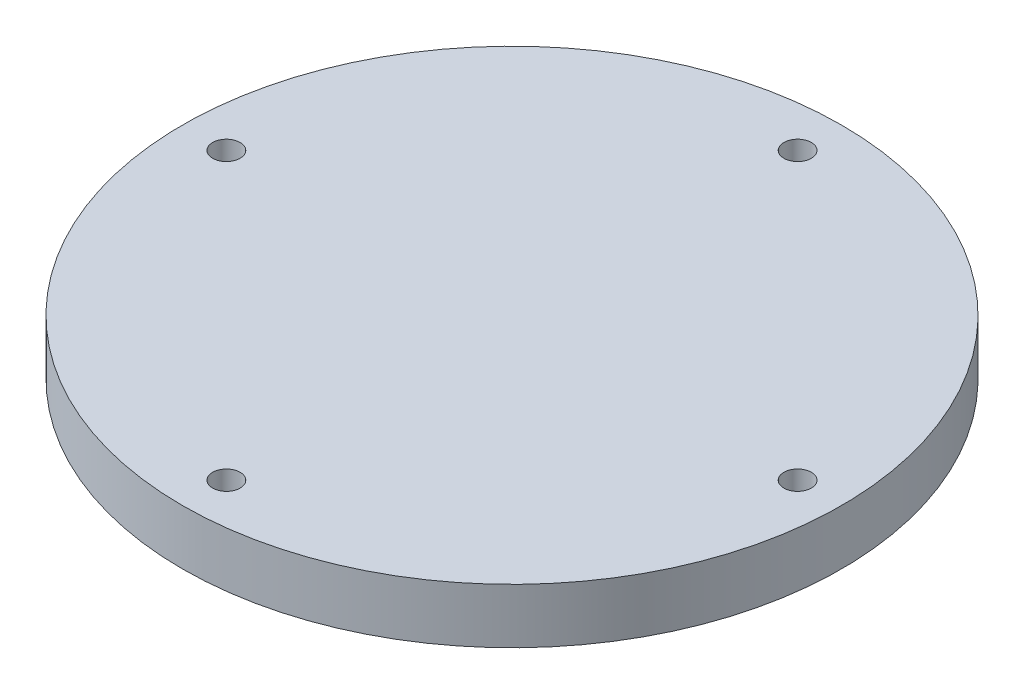
ISO-10303-21;
HEADER;
FILE_DESCRIPTION(('STEP AP214'),'2;1');
FILE_NAME('part.step','',(''),(''),'','','');
FILE_SCHEMA(('AUTOMOTIVE_DESIGN { 1 0 10303 214 1 1 1 1 }'));
ENDSEC;
DATA;
#1=APPLICATION_CONTEXT('core data for automotive mechanical design processes');
#2=APPLICATION_PROTOCOL_DEFINITION('international standard','automotive_design',2000,#1);
#3=PRODUCT_CONTEXT('',#1,'mechanical');
#4=PRODUCT('Part','Part','',(#3));
#5=PRODUCT_RELATED_PRODUCT_CATEGORY('part','',(#4));
#6=PRODUCT_DEFINITION_FORMATION('','',#4);
#7=PRODUCT_DEFINITION_CONTEXT('part definition',#1,'design');
#8=PRODUCT_DEFINITION('design','',#6,#7);
#9=PRODUCT_DEFINITION_SHAPE('','',#8);
#10=(LENGTH_UNIT() NAMED_UNIT(*) SI_UNIT(.MILLI.,.METRE.));
#11=(NAMED_UNIT(*) PLANE_ANGLE_UNIT() SI_UNIT($,.RADIAN.));
#12=(NAMED_UNIT(*) SI_UNIT($,.STERADIAN.) SOLID_ANGLE_UNIT());
#13=UNCERTAINTY_MEASURE_WITH_UNIT(LENGTH_MEASURE(1.E-05),#10,'distance_accuracy_value','');
#14=(GEOMETRIC_REPRESENTATION_CONTEXT(3) GLOBAL_UNCERTAINTY_ASSIGNED_CONTEXT((#13)) GLOBAL_UNIT_ASSIGNED_CONTEXT((#10,
#11,#12)) REPRESENTATION_CONTEXT('',''));
#15=CARTESIAN_POINT('',(0.,0.,0.));
#16=DIRECTION('',(0.,0.,1.));
#17=DIRECTION('',(1.,0.,0.));
#18=AXIS2_PLACEMENT_3D('',#15,#16,#17);
#19=CARTESIAN_POINT('',(0.,6.35,0.));
#20=DIRECTION('',(0.,1.,0.));
#21=DIRECTION('',(0.,0.,1.));
#22=AXIS2_PLACEMENT_3D('',#19,#20,#21);
#23=PLANE('',#22);
#24=CARTESIAN_POINT('',(0.,6.35,33.02));
#25=DIRECTION('',(0.,1.,0.));
#26=DIRECTION('',(0.,0.,1.));
#27=AXIS2_PLACEMENT_3D('',#24,#25,#26);
#28=CIRCLE('',#27,1.5875);
#29=CARTESIAN_POINT('',(0.,6.35,34.6075));
#30=VERTEX_POINT('',#29);
#31=EDGE_CURVE('E53',#30,#30,#28,.T.);
#32=ORIENTED_EDGE('',*,*,#31,.F.);
#33=EDGE_LOOP('',(#32));
#34=FACE_BOUND('',#33,.T.);
#35=CARTESIAN_POINT('',(0.,6.35,-33.02));
#36=DIRECTION('',(0.,1.,0.));
#37=DIRECTION('',(0.,0.,1.));
#38=AXIS2_PLACEMENT_3D('',#35,#36,#37);
#39=CIRCLE('',#38,1.5875);
#40=CARTESIAN_POINT('',(0.,6.35,-31.4325));
#41=VERTEX_POINT('',#40);
#42=EDGE_CURVE('E42',#41,#41,#39,.T.);
#43=ORIENTED_EDGE('',*,*,#42,.F.);
#44=EDGE_LOOP('',(#43));
#45=FACE_BOUND('',#44,.T.);
#46=CARTESIAN_POINT('',(0.,6.35,0.));
#47=DIRECTION('',(0.,1.,0.));
#48=DIRECTION('',(0.,0.,1.));
#49=AXIS2_PLACEMENT_3D('',#46,#47,#48);
#50=CIRCLE('',#49,38.1);
#51=CARTESIAN_POINT('',(0.,6.35,38.1));
#52=VERTEX_POINT('',#51);
#53=EDGE_CURVE('E10',#52,#52,#50,.T.);
#54=ORIENTED_EDGE('',*,*,#53,.T.);
#55=EDGE_LOOP('',(#54));
#56=FACE_BOUND('',#55,.T.);
#57=CARTESIAN_POINT('',(33.02,6.35,0.));
#58=DIRECTION('',(0.,1.,0.));
#59=DIRECTION('',(0.,0.,1.));
#60=AXIS2_PLACEMENT_3D('',#57,#58,#59);
#61=CIRCLE('',#60,1.5875);
#62=CARTESIAN_POINT('',(33.02,6.35,1.5875));
#63=VERTEX_POINT('',#62);
#64=EDGE_CURVE('E47',#63,#63,#61,.T.);
#65=ORIENTED_EDGE('',*,*,#64,.F.);
#66=EDGE_LOOP('',(#65));
#67=FACE_BOUND('',#66,.T.);
#68=CARTESIAN_POINT('',(-33.02,6.35,0.));
#69=DIRECTION('',(0.,1.,0.));
#70=DIRECTION('',(0.,0.,1.));
#71=AXIS2_PLACEMENT_3D('',#68,#69,#70);
#72=CIRCLE('',#71,1.5875);
#73=CARTESIAN_POINT('',(-33.02,6.35,1.58750000000001));
#74=VERTEX_POINT('',#73);
#75=EDGE_CURVE('E59',#74,#74,#72,.T.);
#76=ORIENTED_EDGE('',*,*,#75,.F.);
#77=EDGE_LOOP('',(#76));
#78=FACE_BOUND('',#77,.T.);
#79=ADVANCED_FACE('F31',(#34,#45,#56,#67,#78),#23,.T.);
#80=CARTESIAN_POINT('',(0.,0.,0.));
#81=DIRECTION('',(0.,1.,0.));
#82=DIRECTION('',(0.,0.,1.));
#83=AXIS2_PLACEMENT_3D('',#80,#81,#82);
#84=PLANE('',#83);
#85=CARTESIAN_POINT('',(0.,0.,33.02));
#86=DIRECTION('',(0.,1.,0.));
#87=DIRECTION('',(0.,0.,1.));
#88=AXIS2_PLACEMENT_3D('',#85,#86,#87);
#89=CIRCLE('',#88,1.5875);
#90=CARTESIAN_POINT('',(0.,0.,34.6075));
#91=VERTEX_POINT('',#90);
#92=EDGE_CURVE('E56',#91,#91,#89,.T.);
#93=ORIENTED_EDGE('',*,*,#92,.T.);
#94=EDGE_LOOP('',(#93));
#95=FACE_BOUND('',#94,.T.);
#96=CARTESIAN_POINT('',(0.,0.,-33.02));
#97=DIRECTION('',(0.,1.,0.));
#98=DIRECTION('',(0.,0.,1.));
#99=AXIS2_PLACEMENT_3D('',#96,#97,#98);
#100=CIRCLE('',#99,1.5875);
#101=CARTESIAN_POINT('',(0.,0.,-31.4325));
#102=VERTEX_POINT('',#101);
#103=EDGE_CURVE('E44',#102,#102,#100,.T.);
#104=ORIENTED_EDGE('',*,*,#103,.T.);
#105=EDGE_LOOP('',(#104));
#106=FACE_BOUND('',#105,.T.);
#107=CARTESIAN_POINT('',(0.,0.,0.));
#108=DIRECTION('',(0.,1.,0.));
#109=DIRECTION('',(0.,0.,1.));
#110=AXIS2_PLACEMENT_3D('',#107,#108,#109);
#111=CIRCLE('',#110,38.1);
#112=CARTESIAN_POINT('',(0.,0.,38.1));
#113=VERTEX_POINT('',#112);
#114=EDGE_CURVE('E35',#113,#113,#111,.T.);
#115=ORIENTED_EDGE('',*,*,#114,.F.);
#116=EDGE_LOOP('',(#115));
#117=FACE_BOUND('',#116,.T.);
#118=CARTESIAN_POINT('',(33.02,0.,0.));
#119=DIRECTION('',(0.,1.,0.));
#120=DIRECTION('',(0.,0.,1.));
#121=AXIS2_PLACEMENT_3D('',#118,#119,#120);
#122=CIRCLE('',#121,1.5875);
#123=CARTESIAN_POINT('',(33.02,0.,1.5875));
#124=VERTEX_POINT('',#123);
#125=EDGE_CURVE('E50',#124,#124,#122,.T.);
#126=ORIENTED_EDGE('',*,*,#125,.T.);
#127=EDGE_LOOP('',(#126));
#128=FACE_BOUND('',#127,.T.);
#129=CARTESIAN_POINT('',(-33.02,0.,0.));
#130=DIRECTION('',(0.,1.,0.));
#131=DIRECTION('',(0.,0.,1.));
#132=AXIS2_PLACEMENT_3D('',#129,#130,#131);
#133=CIRCLE('',#132,1.5875);
#134=CARTESIAN_POINT('',(-33.02,0.,1.58750000000001));
#135=VERTEX_POINT('',#134);
#136=EDGE_CURVE('E62',#135,#135,#133,.T.);
#137=ORIENTED_EDGE('',*,*,#136,.T.);
#138=EDGE_LOOP('',(#137));
#139=FACE_BOUND('',#138,.T.);
#140=ADVANCED_FACE('F72',(#95,#106,#117,#128,#139),#84,.F.);
#141=CARTESIAN_POINT('',(0.,6.35,0.));
#142=DIRECTION('',(0.,-1.,0.));
#143=DIRECTION('',(0.,0.,-1.));
#144=AXIS2_PLACEMENT_3D('',#141,#142,#143);
#145=CYLINDRICAL_SURFACE('',#144,38.1);
#146=ORIENTED_EDGE('',*,*,#53,.F.);
#147=EDGE_LOOP('',(#146));
#148=FACE_BOUND('',#147,.T.);
#149=ORIENTED_EDGE('',*,*,#114,.T.);
#150=EDGE_LOOP('',(#149));
#151=FACE_BOUND('',#150,.T.);
#152=ADVANCED_FACE('F33',(#148,#151),#145,.T.);
#153=CARTESIAN_POINT('',(0.,6.35,-33.02));
#154=DIRECTION('',(0.,-1.,0.));
#155=DIRECTION('',(0.,0.,-1.));
#156=AXIS2_PLACEMENT_3D('',#153,#154,#155);
#157=CYLINDRICAL_SURFACE('',#156,1.5875);
#158=ORIENTED_EDGE('',*,*,#42,.T.);
#159=EDGE_LOOP('',(#158));
#160=FACE_BOUND('',#159,.T.);
#161=ORIENTED_EDGE('',*,*,#103,.F.);
#162=EDGE_LOOP('',(#161));
#163=FACE_BOUND('',#162,.T.);
#164=ADVANCED_FACE('F82',(#160,#163),#157,.F.);
#165=CARTESIAN_POINT('',(33.02,6.35,0.));
#166=DIRECTION('',(0.,-1.,0.));
#167=DIRECTION('',(0.,0.,-1.));
#168=AXIS2_PLACEMENT_3D('',#165,#166,#167);
#169=CYLINDRICAL_SURFACE('',#168,1.5875);
#170=ORIENTED_EDGE('',*,*,#64,.T.);
#171=EDGE_LOOP('',(#170));
#172=FACE_BOUND('',#171,.T.);
#173=ORIENTED_EDGE('',*,*,#125,.F.);
#174=EDGE_LOOP('',(#173));
#175=FACE_BOUND('',#174,.T.);
#176=ADVANCED_FACE('F85',(#172,#175),#169,.F.);
#177=CARTESIAN_POINT('',(0.,6.35,33.02));
#178=DIRECTION('',(0.,-1.,0.));
#179=DIRECTION('',(0.,0.,-1.));
#180=AXIS2_PLACEMENT_3D('',#177,#178,#179);
#181=CYLINDRICAL_SURFACE('',#180,1.5875);
#182=ORIENTED_EDGE('',*,*,#31,.T.);
#183=EDGE_LOOP('',(#182));
#184=FACE_BOUND('',#183,.T.);
#185=ORIENTED_EDGE('',*,*,#92,.F.);
#186=EDGE_LOOP('',(#185));
#187=FACE_BOUND('',#186,.T.);
#188=ADVANCED_FACE('F89',(#184,#187),#181,.F.);
#189=CARTESIAN_POINT('',(-33.02,6.35,0.));
#190=DIRECTION('',(0.,-1.,0.));
#191=DIRECTION('',(0.,0.,-1.));
#192=AXIS2_PLACEMENT_3D('',#189,#190,#191);
#193=CYLINDRICAL_SURFACE('',#192,1.5875);
#194=ORIENTED_EDGE('',*,*,#75,.T.);
#195=EDGE_LOOP('',(#194));
#196=FACE_BOUND('',#195,.T.);
#197=ORIENTED_EDGE('',*,*,#136,.F.);
#198=EDGE_LOOP('',(#197));
#199=FACE_BOUND('',#198,.T.);
#200=ADVANCED_FACE('F68',(#196,#199),#193,.F.);
#201=CLOSED_SHELL('',(#79,#140,#152,#164,#176,#188,#200));
#202=MANIFOLD_SOLID_BREP('B2',#201);
#203=ADVANCED_BREP_SHAPE_REPRESENTATION('',(#18,#202),#14);
#204=SHAPE_DEFINITION_REPRESENTATION(#9,#203);
ENDSEC;
END-ISO-10303-21;
